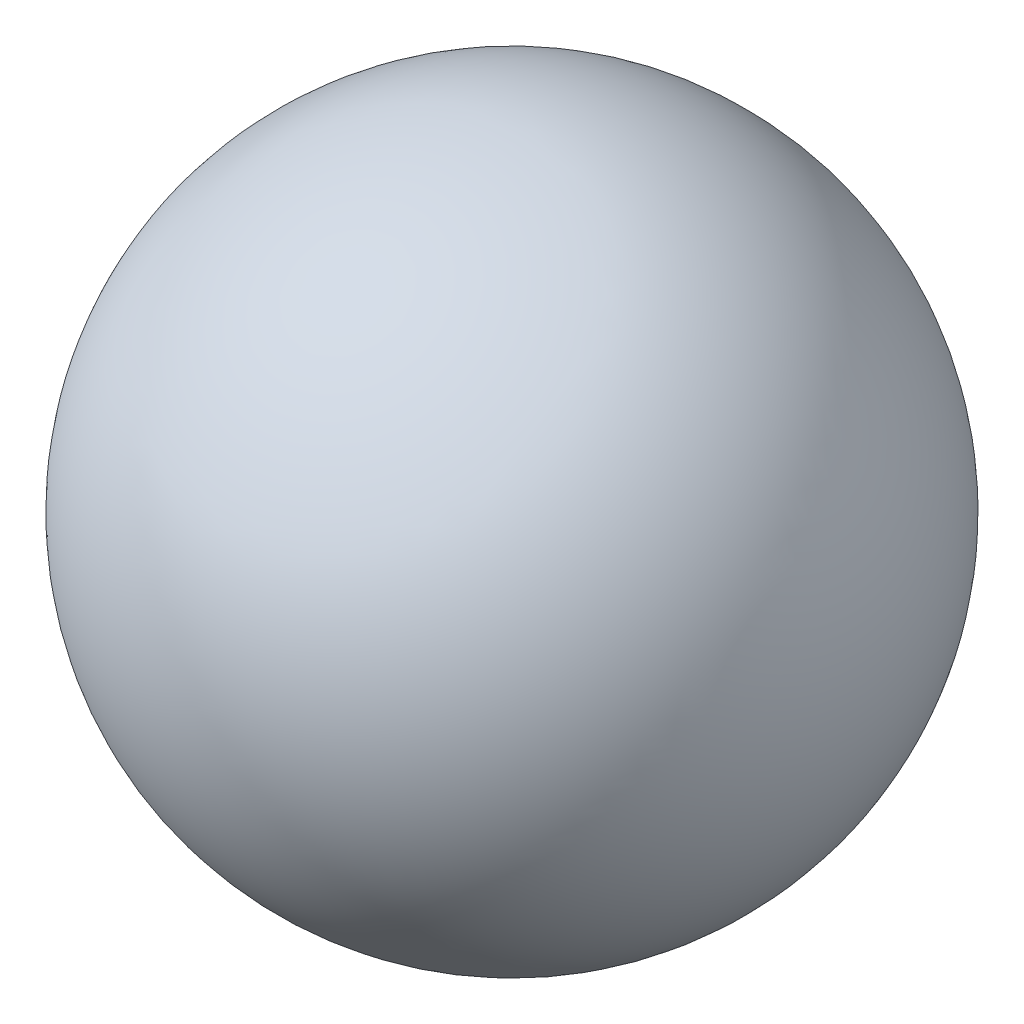
ISO-10303-21;
HEADER;
FILE_DESCRIPTION(('STEP AP214'),'2;1');
FILE_NAME('part.step','',(''),(''),'','','');
FILE_SCHEMA(('AUTOMOTIVE_DESIGN { 1 0 10303 214 1 1 1 1 }'));
ENDSEC;
DATA;
#1=APPLICATION_CONTEXT('core data for automotive mechanical design processes');
#2=APPLICATION_PROTOCOL_DEFINITION('international standard','automotive_design',2000,#1);
#3=PRODUCT_CONTEXT('',#1,'mechanical');
#4=PRODUCT('Part','Part','',(#3));
#5=PRODUCT_RELATED_PRODUCT_CATEGORY('part','',(#4));
#6=PRODUCT_DEFINITION_FORMATION('','',#4);
#7=PRODUCT_DEFINITION_CONTEXT('part definition',#1,'design');
#8=PRODUCT_DEFINITION('design','',#6,#7);
#9=PRODUCT_DEFINITION_SHAPE('','',#8);
#10=(LENGTH_UNIT() NAMED_UNIT(*) SI_UNIT(.MILLI.,.METRE.));
#11=(NAMED_UNIT(*) PLANE_ANGLE_UNIT() SI_UNIT($,.RADIAN.));
#12=(NAMED_UNIT(*) SI_UNIT($,.STERADIAN.) SOLID_ANGLE_UNIT());
#13=UNCERTAINTY_MEASURE_WITH_UNIT(LENGTH_MEASURE(1.E-05),#10,'distance_accuracy_value','');
#14=(GEOMETRIC_REPRESENTATION_CONTEXT(3) GLOBAL_UNCERTAINTY_ASSIGNED_CONTEXT((#13)) GLOBAL_UNIT_ASSIGNED_CONTEXT((#10,
#11,#12)) REPRESENTATION_CONTEXT('',''));
#15=CARTESIAN_POINT('',(0.,0.,0.));
#16=DIRECTION('',(0.,0.,1.));
#17=DIRECTION('',(1.,0.,0.));
#18=AXIS2_PLACEMENT_3D('',#15,#16,#17);
#19=CARTESIAN_POINT('',(0.,0.,0.));
#20=DIRECTION('',(-1.,0.,0.));
#21=DIRECTION('',(0.,1.,0.));
#22=AXIS2_PLACEMENT_3D('',#19,#20,#21);
#23=SPHERICAL_SURFACE('',#22,10.);
#24=CARTESIAN_POINT('',(-10.,0.,0.));
#25=VERTEX_POINT('',#24);
#26=VERTEX_LOOP('',#25);
#27=FACE_BOUND('',#26,.T.);
#28=ADVANCED_FACE('F42',(#27),#23,.T.);
#29=CLOSED_SHELL('',(#28));
#30=MANIFOLD_SOLID_BREP('B2',#29);
#31=CARTESIAN_POINT('',(0.,0.,0.));
#32=DIRECTION('',(-1.,0.,0.));
#33=DIRECTION('',(0.,1.,0.));
#34=AXIS2_PLACEMENT_3D('',#31,#32,#33);
#35=SPHERICAL_SURFACE('',#34,5.);
#36=CARTESIAN_POINT('',(-5.,0.,0.));
#37=VERTEX_POINT('',#36);
#38=VERTEX_LOOP('',#37);
#39=FACE_BOUND('',#38,.T.);
#40=ADVANCED_FACE('F58',(#39),#35,.T.);
#41=CLOSED_SHELL('',(#40));
#42=MANIFOLD_SOLID_BREP('B6',#41);
#43=ADVANCED_BREP_SHAPE_REPRESENTATION('',(#18,#30,#42),#14);
#44=SHAPE_DEFINITION_REPRESENTATION(#9,#43);
ENDSEC;
END-ISO-10303-21;
